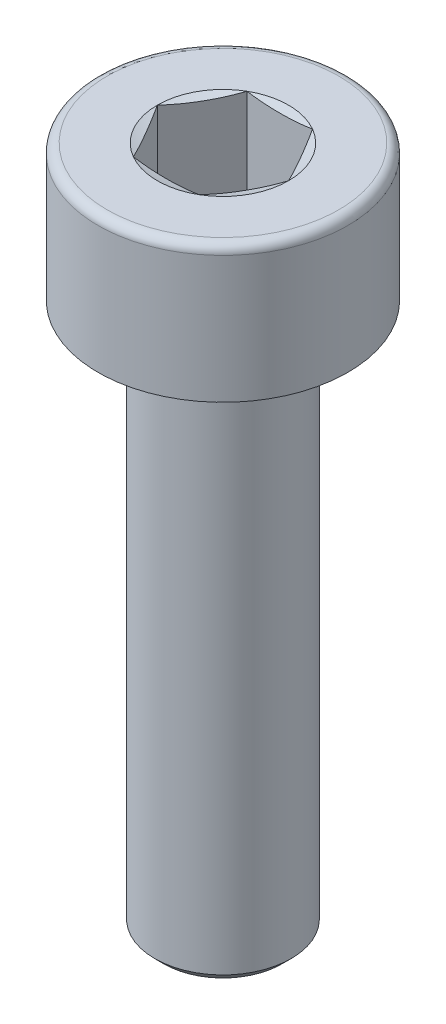
ISO-10303-21;
HEADER;
FILE_DESCRIPTION(('STEP AP214'),'2;1');
FILE_NAME('part.step','',(''),(''),'','','');
FILE_SCHEMA(('AUTOMOTIVE_DESIGN { 1 0 10303 214 1 1 1 1 }'));
ENDSEC;
DATA;
#1=APPLICATION_CONTEXT('core data for automotive mechanical design processes');
#2=APPLICATION_PROTOCOL_DEFINITION('international standard','automotive_design',2000,#1);
#3=PRODUCT_CONTEXT('',#1,'mechanical');
#4=PRODUCT('Part','Part','',(#3));
#5=PRODUCT_RELATED_PRODUCT_CATEGORY('part','',(#4));
#6=PRODUCT_DEFINITION_FORMATION('','',#4);
#7=PRODUCT_DEFINITION_CONTEXT('part definition',#1,'design');
#8=PRODUCT_DEFINITION('design','',#6,#7);
#9=PRODUCT_DEFINITION_SHAPE('','',#8);
#10=(LENGTH_UNIT() NAMED_UNIT(*) SI_UNIT(.MILLI.,.METRE.));
#11=(NAMED_UNIT(*) PLANE_ANGLE_UNIT() SI_UNIT($,.RADIAN.));
#12=(NAMED_UNIT(*) SI_UNIT($,.STERADIAN.) SOLID_ANGLE_UNIT());
#13=UNCERTAINTY_MEASURE_WITH_UNIT(LENGTH_MEASURE(1.E-05),#10,'distance_accuracy_value','');
#14=(GEOMETRIC_REPRESENTATION_CONTEXT(3) GLOBAL_UNCERTAINTY_ASSIGNED_CONTEXT((#13)) GLOBAL_UNIT_ASSIGNED_CONTEXT((#10,
#11,#12)) REPRESENTATION_CONTEXT('',''));
#15=CARTESIAN_POINT('',(0.,0.,0.));
#16=DIRECTION('',(0.,0.,1.));
#17=DIRECTION('',(1.,0.,0.));
#18=AXIS2_PLACEMENT_3D('',#15,#16,#17);
#19=CARTESIAN_POINT('',(-0.721687836487032,1.,1.25));
#20=DIRECTION('',(-0.866025403784438,0.,0.5));
#21=DIRECTION('',(0.5,0.,0.866025403784438));
#22=AXIS2_PLACEMENT_3D('',#19,#20,#21);
#23=PLANE('',#22);
#24=CARTESIAN_POINT('',(-0.721687836487032,3.,1.25));
#25=CARTESIAN_POINT('',(-0.746513124830628,2.99197238531374,1.20700133927634));
#26=CARTESIAN_POINT('',(-0.77141135372941,2.98490176746172,1.16387634180517));
#27=CARTESIAN_POINT('',(-0.821315773136171,2.97255913474823,1.07743935187044));
#28=CARTESIAN_POINT('',(-0.846321947696915,2.96728686283765,1.03412738702829));
#29=CARTESIAN_POINT('',(-0.921207679089362,2.95403550093664,0.904421495494619));
#30=CARTESIAN_POINT('',(-0.971201450687432,2.94854460534836,0.817829743024769));
#31=CARTESIAN_POINT('',(-1.05639422799085,2.94434178449894,0.670271524297354));
#32=CARTESIAN_POINT('',(-1.091578665675,2.94410115539927,0.609330290592659));
#33=CARTESIAN_POINT('',(-1.16192112047074,2.94660140173926,0.487493584957328));
#34=CARTESIAN_POINT('',(-1.19707913913524,2.94934208553123,0.426598110336959));
#35=CARTESIAN_POINT('',(-1.26754233377786,2.95799567884213,0.304552277152318));
#36=CARTESIAN_POINT('',(-1.30284686200085,2.96393024637964,0.243403040532844));
#37=CARTESIAN_POINT('',(-1.37327394982157,2.9792802908976,0.121419746198256));
#38=CARTESIAN_POINT('',(-1.40839646122585,2.98869664635053,0.0605857719566222));
#39=CARTESIAN_POINT('',(-1.44337567297407,3.,0.));
#40=B_SPLINE_CURVE_WITH_KNOTS('',3,(#24,#25,#26,#27,#28,#29,#30,#31,#32,#33,#34,#35,#36,#37,#38,
#39),.UNSPECIFIED.,.F.,.F.,(4,2,2,2,2,2,2,4),(0.,0.150861973818663,0.301702374924401,
0.601886293911623,0.812941524612173,1.02398318885367,1.23647431745907,1.44901909526101),.UNSPECIFIED.);
#41=CARTESIAN_POINT('',(-0.721687836487033,3.,1.25));
#42=VERTEX_POINT('',#41);
#43=CARTESIAN_POINT('',(-1.44337567297406,3.,0.));
#44=VERTEX_POINT('',#43);
#45=EDGE_CURVE('E81',#42,#44,#40,.T.);
#46=ORIENTED_EDGE('',*,*,#45,.F.);
#47=DIRECTION('',(0.,1.,0.));
#48=VECTOR('',#47,1.);
#49=CARTESIAN_POINT('',(-0.721687836487032,1.,1.25));
#50=LINE('',#49,#48);
#51=CARTESIAN_POINT('',(-0.721687836487032,1.,1.25));
#52=VERTEX_POINT('',#51);
#53=EDGE_CURVE('E117',#42,#52,#50,.F.);
#54=ORIENTED_EDGE('',*,*,#53,.T.);
#55=DIRECTION('',(0.5,0.,0.866025403784438));
#56=VECTOR('',#55,1.);
#57=CARTESIAN_POINT('',(-0.721687836487032,1.,1.25));
#58=LINE('',#57,#56);
#59=CARTESIAN_POINT('',(-1.44337567297406,1.,0.));
#60=VERTEX_POINT('',#59);
#61=EDGE_CURVE('E90',#60,#52,#58,.T.);
#62=ORIENTED_EDGE('',*,*,#61,.F.);
#63=DIRECTION('',(0.,1.,0.));
#64=VECTOR('',#63,1.);
#65=CARTESIAN_POINT('',(-1.44337567297406,1.,0.));
#66=LINE('',#65,#64);
#67=EDGE_CURVE('E89',#60,#44,#66,.T.);
#68=ORIENTED_EDGE('',*,*,#67,.T.);
#69=EDGE_LOOP('',(#46,#54,#62,#68));
#70=FACE_BOUND('',#69,.T.);
#71=ADVANCED_FACE('F17',(#70),#23,.F.);
#72=CARTESIAN_POINT('',(-1.44337567297406,1.,0.));
#73=DIRECTION('',(-0.866025403784439,0.,-0.5));
#74=DIRECTION('',(-0.5,0.,0.866025403784439));
#75=AXIS2_PLACEMENT_3D('',#72,#73,#74);
#76=PLANE('',#75);
#77=CARTESIAN_POINT('',(-1.44337567297407,3.,0.));
#78=CARTESIAN_POINT('',(-1.41855038463047,2.99197238531374,-0.0429986607236554));
#79=CARTESIAN_POINT('',(-1.39365215573169,2.98490176746172,-0.0861236581948244));
#80=CARTESIAN_POINT('',(-1.34374773632493,2.97255913474823,-0.172560648129561));
#81=CARTESIAN_POINT('',(-1.31874156176418,2.96728686283765,-0.215872612971706));
#82=CARTESIAN_POINT('',(-1.24385583037173,2.95403550093664,-0.345578504505381));
#83=CARTESIAN_POINT('',(-1.19386205877367,2.94854460534836,-0.432170256975231));
#84=CARTESIAN_POINT('',(-1.10866928147025,2.94434178449894,-0.579728475702646));
#85=CARTESIAN_POINT('',(-1.0734848437861,2.94410115539927,-0.640669709407341));
#86=CARTESIAN_POINT('',(-1.00314238899036,2.94660140173926,-0.762506415042672));
#87=CARTESIAN_POINT('',(-0.967984370325861,2.94934208553123,-0.823401889663042));
#88=CARTESIAN_POINT('',(-0.897521175683237,2.95799567884213,-0.945447722847683));
#89=CARTESIAN_POINT('',(-0.862216647460244,2.96393024637964,-1.00659695946716));
#90=CARTESIAN_POINT('',(-0.791789559639532,2.9792802908976,-1.12858025380174));
#91=CARTESIAN_POINT('',(-0.75666704823525,2.98869664635053,-1.18941422804338));
#92=CARTESIAN_POINT('',(-0.721687836487033,3.,-1.25));
#93=B_SPLINE_CURVE_WITH_KNOTS('',3,(#77,#78,#79,#80,#81,#82,#83,#84,#85,#86,#87,#88,#89,#90,#91,
#92),.UNSPECIFIED.,.F.,.F.,(4,2,2,2,2,2,2,4),(0.,0.150861973818663,0.301702374924401,
0.601886293911623,0.812941524612174,1.02398318885367,1.23647431745908,1.44901909526101),.UNSPECIFIED.);
#94=CARTESIAN_POINT('',(-0.721687836487032,3.,-1.25));
#95=VERTEX_POINT('',#94);
#96=EDGE_CURVE('E96',#44,#95,#93,.T.);
#97=ORIENTED_EDGE('',*,*,#96,.F.);
#98=ORIENTED_EDGE('',*,*,#67,.F.);
#99=DIRECTION('',(0.5,0.,-0.866025403784439));
#100=VECTOR('',#99,1.);
#101=CARTESIAN_POINT('',(-1.44337567297406,1.,0.));
#102=LINE('',#101,#100);
#103=CARTESIAN_POINT('',(-0.721687836487033,1.,-1.25));
#104=VERTEX_POINT('',#103);
#105=EDGE_CURVE('E228',#60,#104,#102,.T.);
#106=ORIENTED_EDGE('',*,*,#105,.T.);
#107=DIRECTION('',(0.,1.,0.));
#108=VECTOR('',#107,1.);
#109=CARTESIAN_POINT('',(-0.721687836487033,1.,-1.25));
#110=LINE('',#109,#108);
#111=EDGE_CURVE('E115',#104,#95,#110,.T.);
#112=ORIENTED_EDGE('',*,*,#111,.T.);
#113=EDGE_LOOP('',(#97,#98,#106,#112));
#114=FACE_BOUND('',#113,.T.);
#115=ADVANCED_FACE('F113',(#114),#76,.F.);
#116=CARTESIAN_POINT('',(0.721687836487032,1.,1.25));
#117=DIRECTION('',(0.,0.,1.));
#118=DIRECTION('',(1.,0.,0.));
#119=AXIS2_PLACEMENT_3D('',#116,#117,#118);
#120=PLANE('',#119);
#121=CARTESIAN_POINT('',(0.721687836487032,3.,1.25));
#122=CARTESIAN_POINT('',(0.67203725979984,2.99197238531374,1.25));
#123=CARTESIAN_POINT('',(0.622240802002277,2.98490176746172,1.25));
#124=CARTESIAN_POINT('',(0.522431963188756,2.97255913474823,1.25));
#125=CARTESIAN_POINT('',(0.472419614067267,2.96728686283765,1.25));
#126=CARTESIAN_POINT('',(0.322648151282372,2.95403550093664,1.25));
#127=CARTESIAN_POINT('',(0.222660608086234,2.94854460534836,1.25));
#128=CARTESIAN_POINT('',(0.0522750534794037,2.94434178449894,1.25));
#129=CARTESIAN_POINT('',(-0.0180938218889025,2.94410115539927,1.25));
#130=CARTESIAN_POINT('',(-0.158778731480374,2.94660140173926,1.25));
#131=CARTESIAN_POINT('',(-0.229094768809375,2.94934208553123,1.25));
#132=CARTESIAN_POINT('',(-0.370021158094624,2.95799567884213,1.25));
#133=CARTESIAN_POINT('',(-0.44063021454061,2.96393024637964,1.25));
#134=CARTESIAN_POINT('',(-0.581484390182034,2.9792802908976,1.25));
#135=CARTESIAN_POINT('',(-0.651729412990598,2.98869664635053,1.25));
#136=CARTESIAN_POINT('',(-0.721687836487032,3.,1.25));
#137=B_SPLINE_CURVE_WITH_KNOTS('',3,(#121,#122,#123,#124,#125,#126,#127,#128,#129,#130,#131,
#132,#133,#134,#135,#136),.UNSPECIFIED.,.F.,.F.,(4,2,2,2,2,2,2,4),(0.,0.150861973818663,
0.301702374924401,0.601886293911622,0.812941524612173,1.02398318885367,1.23647431745907,
1.44901909526101),.UNSPECIFIED.);
#138=CARTESIAN_POINT('',(0.721687836487031,3.,1.25));
#139=VERTEX_POINT('',#138);
#140=EDGE_CURVE('E75',#139,#42,#137,.T.);
#141=ORIENTED_EDGE('',*,*,#140,.F.);
#142=DIRECTION('',(0.,1.,0.));
#143=VECTOR('',#142,1.);
#144=CARTESIAN_POINT('',(0.721687836487032,1.,1.25));
#145=LINE('',#144,#143);
#146=CARTESIAN_POINT('',(0.721687836487032,1.,1.25));
#147=VERTEX_POINT('',#146);
#148=EDGE_CURVE('E211',#139,#147,#145,.F.);
#149=ORIENTED_EDGE('',*,*,#148,.T.);
#150=DIRECTION('',(1.,0.,0.));
#151=VECTOR('',#150,1.);
#152=CARTESIAN_POINT('',(-0.721687836487033,1.,1.25));
#153=LINE('',#152,#151);
#154=EDGE_CURVE('E232',#147,#52,#153,.F.);
#155=ORIENTED_EDGE('',*,*,#154,.T.);
#156=ORIENTED_EDGE('',*,*,#53,.F.);
#157=EDGE_LOOP('',(#141,#149,#155,#156));
#158=FACE_BOUND('',#157,.T.);
#159=ADVANCED_FACE('F138',(#158),#120,.F.);
#160=CARTESIAN_POINT('',(-0.721687836487033,1.,-1.25));
#161=DIRECTION('',(0.,-1.,0.));
#162=DIRECTION('',(0.,0.,-1.));
#163=AXIS2_PLACEMENT_3D('',#160,#161,#162);
#164=PLANE('',#163);
#165=ORIENTED_EDGE('',*,*,#61,.T.);
#166=ORIENTED_EDGE('',*,*,#154,.F.);
#167=DIRECTION('',(0.5,0.,-0.866025403784438));
#168=VECTOR('',#167,1.);
#169=CARTESIAN_POINT('',(1.44337567297406,1.,0.));
#170=LINE('',#169,#168);
#171=CARTESIAN_POINT('',(1.44337567297406,1.,0.));
#172=VERTEX_POINT('',#171);
#173=EDGE_CURVE('E160',#147,#172,#170,.T.);
#174=ORIENTED_EDGE('',*,*,#173,.T.);
#175=DIRECTION('',(-0.5,0.,-0.866025403784439));
#176=VECTOR('',#175,1.);
#177=CARTESIAN_POINT('',(0.721687836487033,1.,-1.25));
#178=LINE('',#177,#176);
#179=CARTESIAN_POINT('',(0.721687836487033,1.,-1.25));
#180=VERTEX_POINT('',#179);
#181=EDGE_CURVE('E208',#172,#180,#178,.T.);
#182=ORIENTED_EDGE('',*,*,#181,.T.);
#183=DIRECTION('',(-1.,0.,0.));
#184=VECTOR('',#183,1.);
#185=CARTESIAN_POINT('',(-0.721687836487033,1.,-1.25));
#186=LINE('',#185,#184);
#187=EDGE_CURVE('E223',#180,#104,#186,.T.);
#188=ORIENTED_EDGE('',*,*,#187,.T.);
#189=ORIENTED_EDGE('',*,*,#105,.F.);
#190=EDGE_LOOP('',(#165,#166,#174,#182,#188,#189));
#191=FACE_BOUND('',#190,.T.);
#192=ADVANCED_FACE('F142',(#191),#164,.F.);
#193=CARTESIAN_POINT('',(-0.721687836487033,1.,-1.25));
#194=DIRECTION('',(0.,0.,-1.));
#195=DIRECTION('',(-1.,0.,0.));
#196=AXIS2_PLACEMENT_3D('',#193,#194,#195);
#197=PLANE('',#196);
#198=CARTESIAN_POINT('',(-0.721687836487032,3.,-1.25));
#199=CARTESIAN_POINT('',(-0.67203725979984,2.99197238531374,-1.25));
#200=CARTESIAN_POINT('',(-0.622240802002278,2.98490176746172,-1.25));
#201=CARTESIAN_POINT('',(-0.522431963188756,2.97255913474823,-1.25));
#202=CARTESIAN_POINT('',(-0.472419614067267,2.96728686283765,-1.25));
#203=CARTESIAN_POINT('',(-0.322648151282373,2.95403550093664,-1.25));
#204=CARTESIAN_POINT('',(-0.222660608086234,2.94854460534836,-1.25));
#205=CARTESIAN_POINT('',(-0.0522750534794042,2.94434178449894,-1.25));
#206=CARTESIAN_POINT('',(0.0180938218889023,2.94410115539927,-1.25));
#207=CARTESIAN_POINT('',(0.158778731480375,2.94660140173926,-1.25));
#208=CARTESIAN_POINT('',(0.229094768809375,2.94934208553123,-1.25));
#209=CARTESIAN_POINT('',(0.370021158094625,2.95799567884213,-1.25));
#210=CARTESIAN_POINT('',(0.440630214540611,2.96393024637964,-1.25));
#211=CARTESIAN_POINT('',(0.581484390182035,2.9792802908976,-1.25));
#212=CARTESIAN_POINT('',(0.6517294129906,2.98869664635053,-1.25));
#213=CARTESIAN_POINT('',(0.721687836487034,3.,-1.25));
#214=B_SPLINE_CURVE_WITH_KNOTS('',3,(#198,#199,#200,#201,#202,#203,#204,#205,#206,#207,#208,
#209,#210,#211,#212,#213),.UNSPECIFIED.,.F.,.F.,(4,2,2,2,2,2,2,4),(0.,0.150861973818663,
0.301702374924401,0.601886293911622,0.812941524612173,1.02398318885367,1.23647431745908,
1.44901909526101),.UNSPECIFIED.);
#215=CARTESIAN_POINT('',(0.721687836487033,3.,-1.25));
#216=VERTEX_POINT('',#215);
#217=EDGE_CURVE('E155',#95,#216,#214,.T.);
#218=ORIENTED_EDGE('',*,*,#217,.F.);
#219=ORIENTED_EDGE('',*,*,#111,.F.);
#220=ORIENTED_EDGE('',*,*,#187,.F.);
#221=DIRECTION('',(0.,1.,0.));
#222=VECTOR('',#221,1.);
#223=CARTESIAN_POINT('',(0.721687836487033,1.,-1.25));
#224=LINE('',#223,#222);
#225=EDGE_CURVE('E203',#180,#216,#224,.T.);
#226=ORIENTED_EDGE('',*,*,#225,.T.);
#227=EDGE_LOOP('',(#218,#219,#220,#226));
#228=FACE_BOUND('',#227,.T.);
#229=ADVANCED_FACE('F146',(#228),#197,.F.);
#230=CARTESIAN_POINT('',(1.44337567297406,1.,0.));
#231=DIRECTION('',(0.866025403784438,0.,0.5));
#232=DIRECTION('',(0.5,0.,-0.866025403784438));
#233=AXIS2_PLACEMENT_3D('',#230,#231,#232);
#234=PLANE('',#233);
#235=CARTESIAN_POINT('',(1.44337567297406,3.,0.));
#236=CARTESIAN_POINT('',(1.41855038463047,2.99197238531374,0.0429986607236575));
#237=CARTESIAN_POINT('',(1.39365215573169,2.98490176746172,0.0861236581948263));
#238=CARTESIAN_POINT('',(1.34374773632493,2.97255913474823,0.172560648129562));
#239=CARTESIAN_POINT('',(1.31874156176418,2.96728686283765,0.215872612971708));
#240=CARTESIAN_POINT('',(1.24385583037173,2.95403550093664,0.345578504505383));
#241=CARTESIAN_POINT('',(1.19386205877366,2.94854460534836,0.432170256975233));
#242=CARTESIAN_POINT('',(1.10866928147025,2.94434178449894,0.579728475702648));
#243=CARTESIAN_POINT('',(1.0734848437861,2.94410115539927,0.640669709407342));
#244=CARTESIAN_POINT('',(1.00314238899036,2.94660140173926,0.762506415042673));
#245=CARTESIAN_POINT('',(0.96798437032586,2.94934208553123,0.823401889663042));
#246=CARTESIAN_POINT('',(0.897521175683236,2.95799567884213,0.945447722847683));
#247=CARTESIAN_POINT('',(0.862216647460243,2.96393024637964,1.00659695946716));
#248=CARTESIAN_POINT('',(0.791789559639531,2.9792802908976,1.12858025380174));
#249=CARTESIAN_POINT('',(0.756667048235249,2.98869664635053,1.18941422804338));
#250=CARTESIAN_POINT('',(0.721687836487032,3.,1.25));
#251=B_SPLINE_CURVE_WITH_KNOTS('',3,(#235,#236,#237,#238,#239,#240,#241,#242,#243,#244,#245,
#246,#247,#248,#249,#250),.UNSPECIFIED.,.F.,.F.,(4,2,2,2,2,2,2,4),(0.,0.150861973818663,
0.301702374924401,0.601886293911623,0.812941524612173,1.02398318885367,1.23647431745907,
1.449019095261),.UNSPECIFIED.);
#252=CARTESIAN_POINT('',(1.44337567297406,3.,0.));
#253=VERTEX_POINT('',#252);
#254=EDGE_CURVE('E161',#253,#139,#251,.T.);
#255=ORIENTED_EDGE('',*,*,#254,.F.);
#256=DIRECTION('',(0.,1.,0.));
#257=VECTOR('',#256,1.);
#258=CARTESIAN_POINT('',(1.44337567297407,1.,0.));
#259=LINE('',#258,#257);
#260=EDGE_CURVE('E199',#253,#172,#259,.F.);
#261=ORIENTED_EDGE('',*,*,#260,.T.);
#262=ORIENTED_EDGE('',*,*,#173,.F.);
#263=ORIENTED_EDGE('',*,*,#148,.F.);
#264=EDGE_LOOP('',(#255,#261,#262,#263));
#265=FACE_BOUND('',#264,.T.);
#266=ADVANCED_FACE('F151',(#265),#234,.F.);
#267=CARTESIAN_POINT('',(0.721687836487033,1.,-1.25));
#268=DIRECTION('',(0.866025403784439,0.,-0.5));
#269=DIRECTION('',(-0.5,0.,-0.866025403784439));
#270=AXIS2_PLACEMENT_3D('',#267,#268,#269);
#271=PLANE('',#270);
#272=CARTESIAN_POINT('',(1.44337567297407,3.,0.));
#273=CARTESIAN_POINT('',(1.41855038463047,2.99197238531374,-0.0429986607236551));
#274=CARTESIAN_POINT('',(1.39365215573169,2.98490176746172,-0.0861236581948239));
#275=CARTESIAN_POINT('',(1.34374773632493,2.97255913474823,-0.17256064812956));
#276=CARTESIAN_POINT('',(1.31874156176418,2.96728686283765,-0.215872612971706));
#277=CARTESIAN_POINT('',(1.24385583037174,2.95403550093664,-0.34557850450538));
#278=CARTESIAN_POINT('',(1.19386205877367,2.94854460534836,-0.43217025697523));
#279=CARTESIAN_POINT('',(1.10866928147025,2.94434178449894,-0.579728475702646));
#280=CARTESIAN_POINT('',(1.0734848437861,2.94410115539927,-0.64066970940734));
#281=CARTESIAN_POINT('',(1.00314238899036,2.94660140173926,-0.762506415042671));
#282=CARTESIAN_POINT('',(0.967984370325862,2.94934208553123,-0.823401889663041));
#283=CARTESIAN_POINT('',(0.897521175683237,2.95799567884213,-0.945447722847681));
#284=CARTESIAN_POINT('',(0.862216647460244,2.96393024637964,-1.00659695946715));
#285=CARTESIAN_POINT('',(0.791789559639533,2.9792802908976,-1.12858025380174));
#286=CARTESIAN_POINT('',(0.756667048235251,2.98869664635053,-1.18941422804338));
#287=CARTESIAN_POINT('',(0.721687836487033,3.,-1.25));
#288=B_SPLINE_CURVE_WITH_KNOTS('',3,(#272,#273,#274,#275,#276,#277,#278,#279,#280,#281,#282,
#283,#284,#285,#286,#287),.UNSPECIFIED.,.F.,.F.,(4,2,2,2,2,2,2,4),(0.,0.150861973818663,
0.301702374924401,0.601886293911623,0.812941524612173,1.02398318885367,1.23647431745907,
1.44901909526101),.UNSPECIFIED.);
#289=EDGE_CURVE('E202',#253,#216,#288,.T.);
#290=ORIENTED_EDGE('',*,*,#289,.T.);
#291=ORIENTED_EDGE('',*,*,#225,.F.);
#292=ORIENTED_EDGE('',*,*,#181,.F.);
#293=ORIENTED_EDGE('',*,*,#260,.F.);
#294=EDGE_LOOP('',(#290,#291,#292,#293));
#295=FACE_BOUND('',#294,.T.);
#296=ADVANCED_FACE('F194',(#295),#271,.F.);
#297=CARTESIAN_POINT('',(-0.520457544102293,5.85450908693594,0.));
#298=DIRECTION('',(0.,0.,1.));
#299=DIRECTION('',(-1.,0.,0.));
#300=AXIS2_PLACEMENT_3D('',#297,#298,#299);
#301=CIRCLE('',#300,3.);
#302=TRIMMED_CURVE('',#301,(PARAMETER_VALUE(-1.74516442055986)),
(PARAMETER_VALUE(1.74516442055986)),.T.,.PARAMETER.);
#303=CARTESIAN_POINT('',(0.,5.85450908693594,0.));
#304=DIRECTION('',(0.,1.,0.));
#305=AXIS1_PLACEMENT('',#303,#304);
#306=SURFACE_OF_REVOLUTION('',#302,#305);
#307=ORIENTED_EDGE('',*,*,#254,.T.);
#308=CARTESIAN_POINT('',(0.,3.,0.));
#309=DIRECTION('',(0.,1.,0.));
#310=DIRECTION('',(-1.,0.,0.));
#311=AXIS2_PLACEMENT_3D('',#308,#309,#310);
#312=CIRCLE('',#311,1.44337567297406);
#313=EDGE_CURVE('E259',#253,#139,#312,.F.);
#314=ORIENTED_EDGE('',*,*,#313,.F.);
#315=EDGE_LOOP('',(#307,#314));
#316=FACE_BOUND('',#315,.T.);
#317=ADVANCED_FACE('F191',(#316),#306,.T.);
#318=CARTESIAN_POINT('',(-0.520457544102293,5.85450908693594,0.));
#319=DIRECTION('',(0.,0.,1.));
#320=DIRECTION('',(-1.,0.,0.));
#321=AXIS2_PLACEMENT_3D('',#318,#319,#320);
#322=CIRCLE('',#321,3.);
#323=TRIMMED_CURVE('',#322,(PARAMETER_VALUE(-1.74516442055986)),
(PARAMETER_VALUE(1.74516442055986)),.T.,.PARAMETER.);
#324=CARTESIAN_POINT('',(0.,5.85450908693594,0.));
#325=DIRECTION('',(0.,1.,0.));
#326=AXIS1_PLACEMENT('',#324,#325);
#327=SURFACE_OF_REVOLUTION('',#323,#326);
#328=ORIENTED_EDGE('',*,*,#140,.T.);
#329=CARTESIAN_POINT('',(0.,3.,0.));
#330=DIRECTION('',(0.,1.,0.));
#331=DIRECTION('',(-1.,0.,0.));
#332=AXIS2_PLACEMENT_3D('',#329,#330,#331);
#333=CIRCLE('',#332,1.44337567297406);
#334=EDGE_CURVE('E106',#139,#42,#333,.F.);
#335=ORIENTED_EDGE('',*,*,#334,.F.);
#336=EDGE_LOOP('',(#328,#335));
#337=FACE_BOUND('',#336,.T.);
#338=ADVANCED_FACE('F188',(#337),#327,.T.);
#339=CARTESIAN_POINT('',(-0.520457544102293,5.85450908693594,0.));
#340=DIRECTION('',(0.,0.,1.));
#341=DIRECTION('',(-1.,0.,0.));
#342=AXIS2_PLACEMENT_3D('',#339,#340,#341);
#343=CIRCLE('',#342,3.);
#344=TRIMMED_CURVE('',#343,(PARAMETER_VALUE(-1.74516442055986)),
(PARAMETER_VALUE(1.74516442055986)),.T.,.PARAMETER.);
#345=CARTESIAN_POINT('',(0.,5.85450908693594,0.));
#346=DIRECTION('',(0.,1.,0.));
#347=AXIS1_PLACEMENT('',#345,#346);
#348=SURFACE_OF_REVOLUTION('',#344,#347);
#349=ORIENTED_EDGE('',*,*,#45,.T.);
#350=CARTESIAN_POINT('',(0.,3.,0.));
#351=DIRECTION('',(0.,1.,0.));
#352=DIRECTION('',(-1.,0.,0.));
#353=AXIS2_PLACEMENT_3D('',#350,#351,#352);
#354=CIRCLE('',#353,1.44337567297406);
#355=EDGE_CURVE('E85',#42,#44,#354,.F.);
#356=ORIENTED_EDGE('',*,*,#355,.F.);
#357=EDGE_LOOP('',(#349,#356));
#358=FACE_BOUND('',#357,.T.);
#359=ADVANCED_FACE('F83',(#358),#348,.T.);
#360=CARTESIAN_POINT('',(-0.520457544102293,5.85450908693594,0.));
#361=DIRECTION('',(0.,0.,1.));
#362=DIRECTION('',(-1.,0.,0.));
#363=AXIS2_PLACEMENT_3D('',#360,#361,#362);
#364=CIRCLE('',#363,3.);
#365=TRIMMED_CURVE('',#364,(PARAMETER_VALUE(-1.74516442055986)),
(PARAMETER_VALUE(1.74516442055986)),.T.,.PARAMETER.);
#366=CARTESIAN_POINT('',(0.,5.85450908693594,0.));
#367=DIRECTION('',(0.,1.,0.));
#368=AXIS1_PLACEMENT('',#366,#367);
#369=SURFACE_OF_REVOLUTION('',#365,#368);
#370=ORIENTED_EDGE('',*,*,#96,.T.);
#371=CARTESIAN_POINT('',(0.,3.,0.));
#372=DIRECTION('',(0.,1.,0.));
#373=DIRECTION('',(-1.,0.,0.));
#374=AXIS2_PLACEMENT_3D('',#371,#372,#373);
#375=CIRCLE('',#374,1.44337567297406);
#376=EDGE_CURVE('E103',#44,#95,#375,.F.);
#377=ORIENTED_EDGE('',*,*,#376,.F.);
#378=EDGE_LOOP('',(#370,#377));
#379=FACE_BOUND('',#378,.T.);
#380=ADVANCED_FACE('F109',(#379),#369,.T.);
#381=CARTESIAN_POINT('',(-0.520457544102293,5.85450908693594,0.));
#382=DIRECTION('',(0.,0.,1.));
#383=DIRECTION('',(-1.,0.,0.));
#384=AXIS2_PLACEMENT_3D('',#381,#382,#383);
#385=CIRCLE('',#384,3.);
#386=TRIMMED_CURVE('',#385,(PARAMETER_VALUE(-1.74516442055986)),
(PARAMETER_VALUE(1.74516442055986)),.T.,.PARAMETER.);
#387=CARTESIAN_POINT('',(0.,5.85450908693594,0.));
#388=DIRECTION('',(0.,1.,0.));
#389=AXIS1_PLACEMENT('',#387,#388);
#390=SURFACE_OF_REVOLUTION('',#386,#389);
#391=ORIENTED_EDGE('',*,*,#217,.T.);
#392=CARTESIAN_POINT('',(0.,3.,0.));
#393=DIRECTION('',(0.,1.,0.));
#394=DIRECTION('',(-1.,0.,0.));
#395=AXIS2_PLACEMENT_3D('',#392,#393,#394);
#396=CIRCLE('',#395,1.44337567297406);
#397=EDGE_CURVE('E111',#95,#216,#396,.F.);
#398=ORIENTED_EDGE('',*,*,#397,.F.);
#399=EDGE_LOOP('',(#391,#398));
#400=FACE_BOUND('',#399,.T.);
#401=ADVANCED_FACE('F167',(#400),#390,.T.);
#402=CARTESIAN_POINT('',(-0.520457544102293,5.85450908693594,0.));
#403=DIRECTION('',(0.,0.,1.));
#404=DIRECTION('',(-1.,0.,0.));
#405=AXIS2_PLACEMENT_3D('',#402,#403,#404);
#406=CIRCLE('',#405,3.);
#407=TRIMMED_CURVE('',#406,(PARAMETER_VALUE(-1.74516442055986)),
(PARAMETER_VALUE(1.74516442055986)),.T.,.PARAMETER.);
#408=CARTESIAN_POINT('',(0.,5.85450908693594,0.));
#409=DIRECTION('',(0.,1.,0.));
#410=AXIS1_PLACEMENT('',#408,#409);
#411=SURFACE_OF_REVOLUTION('',#407,#410);
#412=ORIENTED_EDGE('',*,*,#289,.F.);
#413=CARTESIAN_POINT('',(0.,3.,0.));
#414=DIRECTION('',(0.,1.,0.));
#415=DIRECTION('',(-1.,0.,0.));
#416=AXIS2_PLACEMENT_3D('',#413,#414,#415);
#417=CIRCLE('',#416,1.44337567297406);
#418=EDGE_CURVE('E254',#216,#253,#417,.F.);
#419=ORIENTED_EDGE('',*,*,#418,.F.);
#420=EDGE_LOOP('',(#412,#419));
#421=FACE_BOUND('',#420,.T.);
#422=ADVANCED_FACE('F172',(#421),#411,.T.);
#423=CARTESIAN_POINT('',(0.,3.,0.));
#424=DIRECTION('',(0.,1.,0.));
#425=DIRECTION('',(0.,0.,1.));
#426=AXIS2_PLACEMENT_3D('',#423,#424,#425);
#427=PLANE('',#426);
#428=CARTESIAN_POINT('',(0.,3.,0.));
#429=DIRECTION('',(0.,-1.,0.));
#430=DIRECTION('',(0.,0.,-1.));
#431=AXIS2_PLACEMENT_3D('',#428,#429,#430);
#432=CIRCLE('',#431,2.55);
#433=CARTESIAN_POINT('',(0.,3.,-2.55));
#434=VERTEX_POINT('',#433);
#435=CARTESIAN_POINT('',(0.,3.,2.55));
#436=VERTEX_POINT('',#435);
#437=EDGE_CURVE('E37',#434,#436,#432,.T.);
#438=ORIENTED_EDGE('',*,*,#437,.F.);
#439=CARTESIAN_POINT('',(0.,3.,0.));
#440=DIRECTION('',(0.,-1.,0.));
#441=DIRECTION('',(0.,0.,1.));
#442=AXIS2_PLACEMENT_3D('',#439,#440,#441);
#443=CIRCLE('',#442,2.55);
#444=EDGE_CURVE('E327',#436,#434,#443,.T.);
#445=ORIENTED_EDGE('',*,*,#444,.F.);
#446=EDGE_LOOP('',(#438,#445));
#447=FACE_BOUND('',#446,.T.);
#448=ORIENTED_EDGE('',*,*,#397,.T.);
#449=ORIENTED_EDGE('',*,*,#418,.T.);
#450=ORIENTED_EDGE('',*,*,#313,.T.);
#451=ORIENTED_EDGE('',*,*,#334,.T.);
#452=ORIENTED_EDGE('',*,*,#355,.T.);
#453=ORIENTED_EDGE('',*,*,#376,.T.);
#454=EDGE_LOOP('',(#448,#449,#450,#451,#452,#453));
#455=FACE_BOUND('',#454,.T.);
#456=ADVANCED_FACE('F102',(#447,#455),#427,.T.);
#457=CARTESIAN_POINT('',(0.,2.8,0.));
#458=DIRECTION('',(0.,1.,0.));
#459=DIRECTION('',(0.,0.,1.));
#460=AXIS2_PLACEMENT_3D('',#457,#458,#459);
#461=TOROIDAL_SURFACE('',#460,2.55,0.2);
#462=CARTESIAN_POINT('',(0.,2.8,0.));
#463=DIRECTION('',(0.,-1.,0.));
#464=DIRECTION('',(0.,0.,-1.));
#465=AXIS2_PLACEMENT_3D('',#462,#463,#464);
#466=CIRCLE('',#465,2.75);
#467=CARTESIAN_POINT('',(0.,2.8,-2.75));
#468=VERTEX_POINT('',#467);
#469=EDGE_CURVE('E253',#468,#468,#466,.T.);
#470=ORIENTED_EDGE('',*,*,#469,.F.);
#471=EDGE_LOOP('',(#470));
#472=FACE_BOUND('',#471,.T.);
#473=ORIENTED_EDGE('',*,*,#444,.T.);
#474=ORIENTED_EDGE('',*,*,#437,.T.);
#475=EDGE_LOOP('',(#473,#474));
#476=FACE_BOUND('',#475,.T.);
#477=ADVANCED_FACE('F304',(#472,#476),#461,.T.);
#478=CARTESIAN_POINT('',(0.,-12.,0.));
#479=DIRECTION('',(0.,-1.,0.));
#480=DIRECTION('',(0.,0.,-1.));
#481=AXIS2_PLACEMENT_3D('',#478,#479,#480);
#482=PLANE('',#481);
#483=CARTESIAN_POINT('',(0.,-12.0000000000005,0.));
#484=DIRECTION('',(0.,1.,0.));
#485=DIRECTION('',(0.,0.,1.));
#486=AXIS2_PLACEMENT_3D('',#483,#484,#485);
#487=CIRCLE('',#486,1.29999999995789);
#488=CARTESIAN_POINT('',(0.,-12.0000000000005,1.29999999995789));
#489=VERTEX_POINT('',#488);
#490=EDGE_CURVE('E250',#489,#489,#487,.T.);
#491=ORIENTED_EDGE('',*,*,#490,.F.);
#492=EDGE_LOOP('',(#491));
#493=FACE_BOUND('',#492,.T.);
#494=ADVANCED_FACE('F301',(#493),#482,.T.);
#495=CARTESIAN_POINT('',(0.,3.,0.));
#496=DIRECTION('',(0.,-1.,0.));
#497=DIRECTION('',(0.,0.,-1.));
#498=AXIS2_PLACEMENT_3D('',#495,#496,#497);
#499=CYLINDRICAL_SURFACE('',#498,2.75);
#500=ORIENTED_EDGE('',*,*,#469,.T.);
#501=EDGE_LOOP('',(#500));
#502=FACE_BOUND('',#501,.T.);
#503=CARTESIAN_POINT('',(0.,0.,0.));
#504=DIRECTION('',(0.,-1.,0.));
#505=DIRECTION('',(0.,0.,-1.));
#506=AXIS2_PLACEMENT_3D('',#503,#504,#505);
#507=CIRCLE('',#506,2.75);
#508=CARTESIAN_POINT('',(0.,0.,-2.75));
#509=VERTEX_POINT('',#508);
#510=EDGE_CURVE('E247',#509,#509,#507,.F.);
#511=ORIENTED_EDGE('',*,*,#510,.T.);
#512=EDGE_LOOP('',(#511));
#513=FACE_BOUND('',#512,.T.);
#514=ADVANCED_FACE('F297',(#502,#513),#499,.T.);
#515=CARTESIAN_POINT('',(0.,-11.7999999998801,0.));
#516=DIRECTION('',(0.,1.,0.));
#517=DIRECTION('',(0.,0.,1.));
#518=AXIS2_PLACEMENT_3D('',#515,#516,#517);
#519=CONICAL_SURFACE('',#518,1.50000000007822,0.785398163397448);
#520=CARTESIAN_POINT('',(0.,-11.8,0.));
#521=DIRECTION('',(0.,1.,0.));
#522=DIRECTION('',(0.,0.,1.));
#523=AXIS2_PLACEMENT_3D('',#520,#521,#522);
#524=CIRCLE('',#523,1.5);
#525=CARTESIAN_POINT('',(0.,-11.8,1.5));
#526=VERTEX_POINT('',#525);
#527=EDGE_CURVE('E29',#526,#526,#524,.T.);
#528=ORIENTED_EDGE('',*,*,#527,.F.);
#529=EDGE_LOOP('',(#528));
#530=FACE_BOUND('',#529,.T.);
#531=ORIENTED_EDGE('',*,*,#490,.T.);
#532=EDGE_LOOP('',(#531));
#533=FACE_BOUND('',#532,.T.);
#534=ADVANCED_FACE('F290',(#530,#533),#519,.T.);
#535=CARTESIAN_POINT('',(0.,0.,0.));
#536=DIRECTION('',(0.,1.,0.));
#537=DIRECTION('',(0.,0.,1.));
#538=AXIS2_PLACEMENT_3D('',#535,#536,#537);
#539=PLANE('',#538);
#540=CARTESIAN_POINT('',(0.,0.,0.));
#541=DIRECTION('',(0.,1.,0.));
#542=DIRECTION('',(0.,0.,1.));
#543=AXIS2_PLACEMENT_3D('',#540,#541,#542);
#544=CIRCLE('',#543,1.5);
#545=CARTESIAN_POINT('',(0.,0.,1.5));
#546=VERTEX_POINT('',#545);
#547=EDGE_CURVE('E11',#546,#546,#544,.F.);
#548=ORIENTED_EDGE('',*,*,#547,.F.);
#549=EDGE_LOOP('',(#548));
#550=FACE_BOUND('',#549,.T.);
#551=ORIENTED_EDGE('',*,*,#510,.F.);
#552=EDGE_LOOP('',(#551));
#553=FACE_BOUND('',#552,.T.);
#554=ADVANCED_FACE('F284',(#550,#553),#539,.F.);
#555=CARTESIAN_POINT('',(0.,-12.,0.));
#556=DIRECTION('',(0.,1.,0.));
#557=DIRECTION('',(0.,0.,1.));
#558=AXIS2_PLACEMENT_3D('',#555,#556,#557);
#559=CYLINDRICAL_SURFACE('',#558,1.5);
#560=ORIENTED_EDGE('',*,*,#547,.T.);
#561=EDGE_LOOP('',(#560));
#562=FACE_BOUND('',#561,.T.);
#563=ORIENTED_EDGE('',*,*,#527,.T.);
#564=EDGE_LOOP('',(#563));
#565=FACE_BOUND('',#564,.T.);
#566=ADVANCED_FACE('F282',(#562,#565),#559,.T.);
#567=CLOSED_SHELL('',(#71,#115,#159,#192,#229,#266,#296,#317,#338,#359,#380,#401,#422,#456,#477,
#494,#514,#534,#554,#566));
#568=MANIFOLD_SOLID_BREP('B1',#567);
#569=ADVANCED_BREP_SHAPE_REPRESENTATION('',(#18,#568),#14);
#570=SHAPE_DEFINITION_REPRESENTATION(#9,#569);
ENDSEC;
END-ISO-10303-21;
